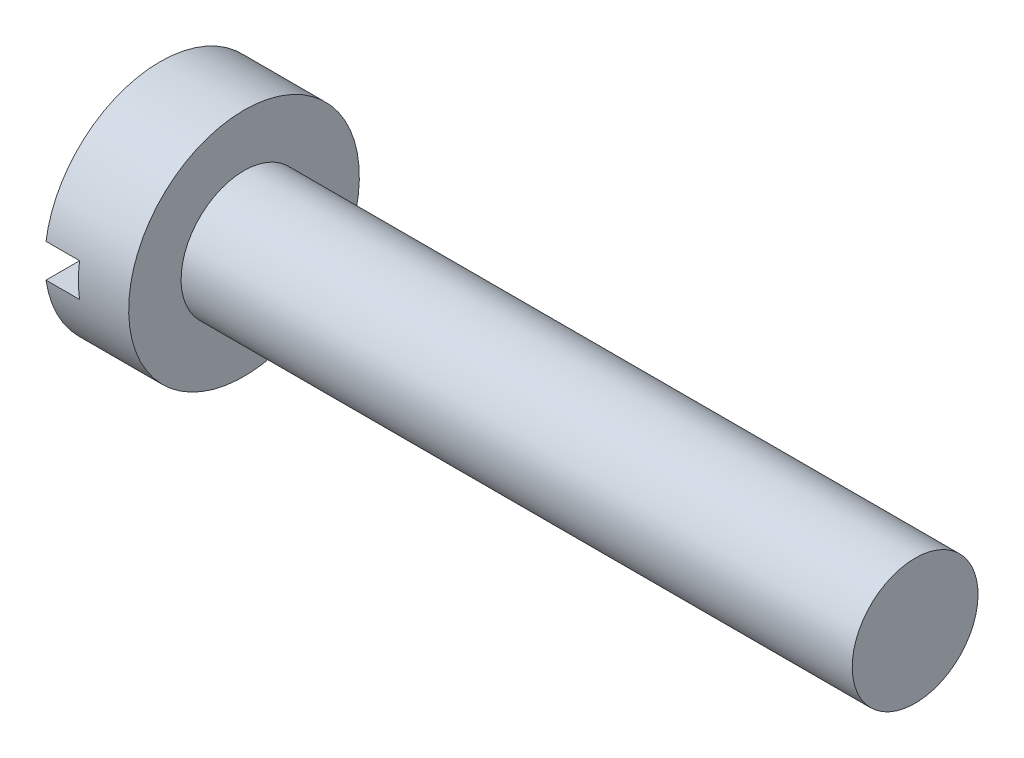
ISO-10303-21;
HEADER;
FILE_DESCRIPTION(('STEP AP214'),'2;1');
FILE_NAME('part.step','',(''),(''),'','','');
FILE_SCHEMA(('AUTOMOTIVE_DESIGN { 1 0 10303 214 1 1 1 1 }'));
ENDSEC;
DATA;
#1=APPLICATION_CONTEXT('core data for automotive mechanical design processes');
#2=APPLICATION_PROTOCOL_DEFINITION('international standard','automotive_design',2000,#1);
#3=PRODUCT_CONTEXT('',#1,'mechanical');
#4=PRODUCT('Part','Part','',(#3));
#5=PRODUCT_RELATED_PRODUCT_CATEGORY('part','',(#4));
#6=PRODUCT_DEFINITION_FORMATION('','',#4);
#7=PRODUCT_DEFINITION_CONTEXT('part definition',#1,'design');
#8=PRODUCT_DEFINITION('design','',#6,#7);
#9=PRODUCT_DEFINITION_SHAPE('','',#8);
#10=(LENGTH_UNIT() NAMED_UNIT(*) SI_UNIT(.MILLI.,.METRE.));
#11=(NAMED_UNIT(*) PLANE_ANGLE_UNIT() SI_UNIT($,.RADIAN.));
#12=(NAMED_UNIT(*) SI_UNIT($,.STERADIAN.) SOLID_ANGLE_UNIT());
#13=UNCERTAINTY_MEASURE_WITH_UNIT(LENGTH_MEASURE(1.E-05),#10,'distance_accuracy_value','');
#14=(GEOMETRIC_REPRESENTATION_CONTEXT(3) GLOBAL_UNCERTAINTY_ASSIGNED_CONTEXT((#13)) GLOBAL_UNIT_ASSIGNED_CONTEXT((#10,
#11,#12)) REPRESENTATION_CONTEXT('',''));
#15=CARTESIAN_POINT('',(0.,0.,0.));
#16=DIRECTION('',(0.,0.,1.));
#17=DIRECTION('',(1.,0.,0.));
#18=AXIS2_PLACEMENT_3D('',#15,#16,#17);
#19=CARTESIAN_POINT('',(0.,0.,0.));
#20=DIRECTION('',(-1.,0.,0.));
#21=DIRECTION('',(0.,-1.,0.));
#22=AXIS2_PLACEMENT_3D('',#19,#20,#21);
#23=PLANE('',#22);
#24=DIRECTION('',(0.,0.,-1.));
#25=VECTOR('',#24,1.);
#26=CARTESIAN_POINT('',(0.,0.399999999999997,-2.75));
#27=LINE('',#26,#25);
#28=CARTESIAN_POINT('',(0.,0.399999999999999,2.72075357208256));
#29=VERTEX_POINT('',#28);
#30=CARTESIAN_POINT('',(0.,0.399999999999997,-2.72075357208256));
#31=VERTEX_POINT('',#30);
#32=EDGE_CURVE('E83',#29,#31,#27,.T.);
#33=ORIENTED_EDGE('',*,*,#32,.F.);
#34=CARTESIAN_POINT('',(0.,0.,0.));
#35=DIRECTION('',(1.,0.,0.));
#36=DIRECTION('',(0.,1.,0.));
#37=AXIS2_PLACEMENT_3D('',#34,#35,#36);
#38=CIRCLE('',#37,2.75);
#39=EDGE_CURVE('E89',#31,#29,#38,.T.);
#40=ORIENTED_EDGE('',*,*,#39,.F.);
#41=EDGE_LOOP('',(#33,#40));
#42=FACE_BOUND('',#41,.T.);
#43=ADVANCED_FACE('F33',(#42),#23,.T.);
#44=DIRECTION('',(0.,0.,1.));
#45=VECTOR('',#44,1.);
#46=CARTESIAN_POINT('',(0.,-0.400000000000001,-2.75));
#47=LINE('',#46,#45);
#48=CARTESIAN_POINT('',(0.,-0.400000000000001,-2.72075357208256));
#49=VERTEX_POINT('',#48);
#50=CARTESIAN_POINT('',(0.,-0.399999999999999,2.72075357208256));
#51=VERTEX_POINT('',#50);
#52=EDGE_CURVE('E77',#49,#51,#47,.T.);
#53=ORIENTED_EDGE('',*,*,#52,.F.);
#54=EDGE_CURVE('E82',#51,#49,#38,.T.);
#55=ORIENTED_EDGE('',*,*,#54,.F.);
#56=EDGE_LOOP('',(#53,#55));
#57=FACE_BOUND('',#56,.T.);
#58=ADVANCED_FACE('F35',(#57),#23,.T.);
#59=CARTESIAN_POINT('',(18.,0.,0.));
#60=DIRECTION('',(1.,0.,0.));
#61=DIRECTION('',(0.,1.,0.));
#62=AXIS2_PLACEMENT_3D('',#59,#60,#61);
#63=CYLINDRICAL_SURFACE('',#62,2.75);
#64=DIRECTION('',(1.,0.,0.));
#65=VECTOR('',#64,1.);
#66=CARTESIAN_POINT('',(18.,0.399999999999997,-2.72075357208256));
#67=LINE('',#66,#65);
#68=CARTESIAN_POINT('',(0.799999999999999,0.399999999999997,-2.72075357208256));
#69=VERTEX_POINT('',#68);
#70=EDGE_CURVE('E11',#31,#69,#67,.T.);
#71=ORIENTED_EDGE('',*,*,#70,.F.);
#72=ORIENTED_EDGE('',*,*,#39,.T.);
#73=DIRECTION('',(1.,0.,0.));
#74=VECTOR('',#73,1.);
#75=CARTESIAN_POINT('',(18.,0.399999999999999,2.72075357208256));
#76=LINE('',#75,#74);
#77=CARTESIAN_POINT('',(0.799999999999999,0.399999999999999,2.72075357208256));
#78=VERTEX_POINT('',#77);
#79=EDGE_CURVE('E98',#78,#29,#76,.F.);
#80=ORIENTED_EDGE('',*,*,#79,.F.);
#81=CARTESIAN_POINT('',(0.799999999999999,0.,0.));
#82=DIRECTION('',(-1.,0.,0.));
#83=DIRECTION('',(0.,0.,1.));
#84=AXIS2_PLACEMENT_3D('',#81,#82,#83);
#85=CIRCLE('',#84,2.75);
#86=CARTESIAN_POINT('',(0.799999999999999,-0.399999999999999,2.72075357208256));
#87=VERTEX_POINT('',#86);
#88=EDGE_CURVE('E48',#78,#87,#85,.F.);
#89=ORIENTED_EDGE('',*,*,#88,.T.);
#90=DIRECTION('',(1.,0.,0.));
#91=VECTOR('',#90,1.);
#92=CARTESIAN_POINT('',(18.,-0.399999999999999,2.72075357208256));
#93=LINE('',#92,#91);
#94=EDGE_CURVE('E88',#51,#87,#93,.T.);
#95=ORIENTED_EDGE('',*,*,#94,.F.);
#96=ORIENTED_EDGE('',*,*,#54,.T.);
#97=DIRECTION('',(1.,0.,0.));
#98=VECTOR('',#97,1.);
#99=CARTESIAN_POINT('',(18.,-0.400000000000001,-2.72075357208256));
#100=LINE('',#99,#98);
#101=CARTESIAN_POINT('',(0.799999999999999,-0.400000000000001,-2.72075357208256));
#102=VERTEX_POINT('',#101);
#103=EDGE_CURVE('E41',#102,#49,#100,.F.);
#104=ORIENTED_EDGE('',*,*,#103,.F.);
#105=EDGE_CURVE('E56',#102,#69,#85,.F.);
#106=ORIENTED_EDGE('',*,*,#105,.T.);
#107=EDGE_LOOP('',(#71,#72,#80,#89,#95,#96,#104,#106));
#108=FACE_BOUND('',#107,.T.);
#109=CARTESIAN_POINT('',(2.,0.,0.));
#110=DIRECTION('',(1.,0.,0.));
#111=DIRECTION('',(0.,1.,0.));
#112=AXIS2_PLACEMENT_3D('',#109,#110,#111);
#113=CIRCLE('',#112,2.75);
#114=CARTESIAN_POINT('',(2.,2.75,0.));
#115=VERTEX_POINT('',#114);
#116=EDGE_CURVE('E93',#115,#115,#113,.T.);
#117=ORIENTED_EDGE('',*,*,#116,.F.);
#118=EDGE_LOOP('',(#117));
#119=FACE_BOUND('',#118,.T.);
#120=ADVANCED_FACE('F86',(#108,#119),#63,.T.);
#121=CARTESIAN_POINT('',(2.,2.75,0.));
#122=DIRECTION('',(1.,0.,0.));
#123=DIRECTION('',(0.,1.,0.));
#124=AXIS2_PLACEMENT_3D('',#121,#122,#123);
#125=PLANE('',#124);
#126=ORIENTED_EDGE('',*,*,#116,.T.);
#127=EDGE_LOOP('',(#126));
#128=FACE_BOUND('',#127,.T.);
#129=CARTESIAN_POINT('',(2.,0.,0.));
#130=DIRECTION('',(1.,0.,0.));
#131=DIRECTION('',(0.,1.,0.));
#132=AXIS2_PLACEMENT_3D('',#129,#130,#131);
#133=CIRCLE('',#132,1.5);
#134=CARTESIAN_POINT('',(2.,1.5,0.));
#135=VERTEX_POINT('',#134);
#136=EDGE_CURVE('E111',#135,#135,#133,.T.);
#137=ORIENTED_EDGE('',*,*,#136,.F.);
#138=EDGE_LOOP('',(#137));
#139=FACE_BOUND('',#138,.T.);
#140=ADVANCED_FACE('F118',(#128,#139),#125,.T.);
#141=CARTESIAN_POINT('',(18.,0.,0.));
#142=DIRECTION('',(1.,0.,0.));
#143=DIRECTION('',(0.,1.,0.));
#144=AXIS2_PLACEMENT_3D('',#141,#142,#143);
#145=CYLINDRICAL_SURFACE('',#144,1.5);
#146=ORIENTED_EDGE('',*,*,#136,.T.);
#147=EDGE_LOOP('',(#146));
#148=FACE_BOUND('',#147,.T.);
#149=CARTESIAN_POINT('',(18.,0.,0.));
#150=DIRECTION('',(1.,0.,0.));
#151=DIRECTION('',(0.,1.,0.));
#152=AXIS2_PLACEMENT_3D('',#149,#150,#151);
#153=CIRCLE('',#152,1.5);
#154=CARTESIAN_POINT('',(18.,1.5,0.));
#155=VERTEX_POINT('',#154);
#156=EDGE_CURVE('E109',#155,#155,#153,.T.);
#157=ORIENTED_EDGE('',*,*,#156,.F.);
#158=EDGE_LOOP('',(#157));
#159=FACE_BOUND('',#158,.T.);
#160=ADVANCED_FACE('F125',(#148,#159),#145,.T.);
#161=CARTESIAN_POINT('',(18.,1.5,0.));
#162=DIRECTION('',(1.,0.,0.));
#163=DIRECTION('',(0.,1.,0.));
#164=AXIS2_PLACEMENT_3D('',#161,#162,#163);
#165=PLANE('',#164);
#166=ORIENTED_EDGE('',*,*,#156,.T.);
#167=EDGE_LOOP('',(#166));
#168=FACE_BOUND('',#167,.T.);
#169=ADVANCED_FACE('F150',(#168),#165,.T.);
#170=CARTESIAN_POINT('',(0.8,0.399999999999997,-2.75));
#171=DIRECTION('',(0.,1.,0.));
#172=DIRECTION('',(0.,0.,1.));
#173=AXIS2_PLACEMENT_3D('',#170,#171,#172);
#174=PLANE('',#173);
#175=ORIENTED_EDGE('',*,*,#79,.T.);
#176=ORIENTED_EDGE('',*,*,#32,.T.);
#177=ORIENTED_EDGE('',*,*,#70,.T.);
#178=DIRECTION('',(0.,0.,-1.));
#179=VECTOR('',#178,1.);
#180=CARTESIAN_POINT('',(0.8,0.399999999999997,-2.75));
#181=LINE('',#180,#179);
#182=EDGE_CURVE('E105',#78,#69,#181,.T.);
#183=ORIENTED_EDGE('',*,*,#182,.F.);
#184=EDGE_LOOP('',(#175,#176,#177,#183));
#185=FACE_BOUND('',#184,.T.);
#186=ADVANCED_FACE('F145',(#185),#174,.F.);
#187=CARTESIAN_POINT('',(0.8,-0.400000000000001,-2.75));
#188=DIRECTION('',(0.,-1.,0.));
#189=DIRECTION('',(0.,0.,-1.));
#190=AXIS2_PLACEMENT_3D('',#187,#188,#189);
#191=PLANE('',#190);
#192=ORIENTED_EDGE('',*,*,#103,.T.);
#193=ORIENTED_EDGE('',*,*,#52,.T.);
#194=ORIENTED_EDGE('',*,*,#94,.T.);
#195=DIRECTION('',(0.,0.,1.));
#196=VECTOR('',#195,1.);
#197=CARTESIAN_POINT('',(0.8,-0.400000000000001,-2.75));
#198=LINE('',#197,#196);
#199=EDGE_CURVE('E78',#102,#87,#198,.T.);
#200=ORIENTED_EDGE('',*,*,#199,.F.);
#201=EDGE_LOOP('',(#192,#193,#194,#200));
#202=FACE_BOUND('',#201,.T.);
#203=ADVANCED_FACE('F76',(#202),#191,.F.);
#204=CARTESIAN_POINT('',(0.8,0.,0.));
#205=DIRECTION('',(-1.,0.,0.));
#206=DIRECTION('',(0.,0.,1.));
#207=AXIS2_PLACEMENT_3D('',#204,#205,#206);
#208=PLANE('',#207);
#209=ORIENTED_EDGE('',*,*,#199,.T.);
#210=ORIENTED_EDGE('',*,*,#88,.F.);
#211=ORIENTED_EDGE('',*,*,#182,.T.);
#212=ORIENTED_EDGE('',*,*,#105,.F.);
#213=EDGE_LOOP('',(#209,#210,#211,#212));
#214=FACE_BOUND('',#213,.T.);
#215=ADVANCED_FACE('F160',(#214),#208,.T.);
#216=CLOSED_SHELL('',(#43,#58,#120,#140,#160,#169,#186,#203,#215));
#217=MANIFOLD_SOLID_BREP('B2',#216);
#218=ADVANCED_BREP_SHAPE_REPRESENTATION('',(#18,#217),#14);
#219=SHAPE_DEFINITION_REPRESENTATION(#9,#218);
ENDSEC;
END-ISO-10303-21;
